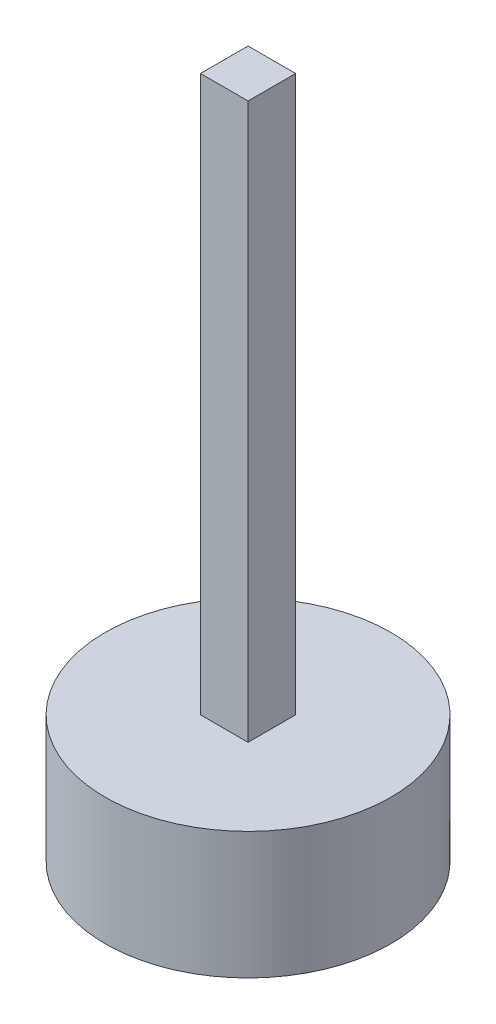
ISO-10303-21;
HEADER;
FILE_DESCRIPTION(('STEP AP214'),'2;1');
FILE_NAME('part.step','',(''),(''),'','','');
FILE_SCHEMA(('AUTOMOTIVE_DESIGN { 1 0 10303 214 1 1 1 1 }'));
ENDSEC;
DATA;
#1=APPLICATION_CONTEXT('core data for automotive mechanical design processes');
#2=APPLICATION_PROTOCOL_DEFINITION('international standard','automotive_design',2000,#1);
#3=PRODUCT_CONTEXT('',#1,'mechanical');
#4=PRODUCT('Part','Part','',(#3));
#5=PRODUCT_RELATED_PRODUCT_CATEGORY('part','',(#4));
#6=PRODUCT_DEFINITION_FORMATION('','',#4);
#7=PRODUCT_DEFINITION_CONTEXT('part definition',#1,'design');
#8=PRODUCT_DEFINITION('design','',#6,#7);
#9=PRODUCT_DEFINITION_SHAPE('','',#8);
#10=(LENGTH_UNIT() NAMED_UNIT(*) SI_UNIT(.MILLI.,.METRE.));
#11=(NAMED_UNIT(*) PLANE_ANGLE_UNIT() SI_UNIT($,.RADIAN.));
#12=(NAMED_UNIT(*) SI_UNIT($,.STERADIAN.) SOLID_ANGLE_UNIT());
#13=UNCERTAINTY_MEASURE_WITH_UNIT(LENGTH_MEASURE(1.E-05),#10,'distance_accuracy_value','');
#14=(GEOMETRIC_REPRESENTATION_CONTEXT(3) GLOBAL_UNCERTAINTY_ASSIGNED_CONTEXT((#13)) GLOBAL_UNIT_ASSIGNED_CONTEXT((#10,
#11,#12)) REPRESENTATION_CONTEXT('',''));
#15=CARTESIAN_POINT('',(0.,0.,0.));
#16=DIRECTION('',(0.,0.,1.));
#17=DIRECTION('',(1.,0.,0.));
#18=AXIS2_PLACEMENT_3D('',#15,#16,#17);
#19=CARTESIAN_POINT('',(15.,-350.,0.));
#20=DIRECTION('',(1.,0.,0.));
#21=DIRECTION('',(0.,0.,-1.));
#22=AXIS2_PLACEMENT_3D('',#19,#20,#21);
#23=PLANE('',#22);
#24=DIRECTION('',(0.,0.,-1.));
#25=VECTOR('',#24,1.);
#26=CARTESIAN_POINT('',(15.,0.,0.));
#27=LINE('',#26,#25);
#28=CARTESIAN_POINT('',(15.,0.,0.));
#29=VERTEX_POINT('',#28);
#30=CARTESIAN_POINT('',(15.,0.,-30.));
#31=VERTEX_POINT('',#30);
#32=EDGE_CURVE('E104',#29,#31,#27,.T.);
#33=ORIENTED_EDGE('',*,*,#32,.F.);
#34=DIRECTION('',(0.,1.,0.));
#35=VECTOR('',#34,1.);
#36=CARTESIAN_POINT('',(15.,-350.,0.));
#37=LINE('',#36,#35);
#38=CARTESIAN_POINT('',(15.,-350.,0.));
#39=VERTEX_POINT('',#38);
#40=EDGE_CURVE('E11',#39,#29,#37,.T.);
#41=ORIENTED_EDGE('',*,*,#40,.F.);
#42=DIRECTION('',(0.,0.,-1.));
#43=VECTOR('',#42,1.);
#44=CARTESIAN_POINT('',(15.,-350.,0.));
#45=LINE('',#44,#43);
#46=CARTESIAN_POINT('',(15.,-350.,-30.));
#47=VERTEX_POINT('',#46);
#48=EDGE_CURVE('E89',#39,#47,#45,.T.);
#49=ORIENTED_EDGE('',*,*,#48,.T.);
#50=DIRECTION('',(0.,1.,0.));
#51=VECTOR('',#50,1.);
#52=CARTESIAN_POINT('',(15.,-350.,-30.));
#53=LINE('',#52,#51);
#54=EDGE_CURVE('E38',#47,#31,#53,.T.);
#55=ORIENTED_EDGE('',*,*,#54,.T.);
#56=EDGE_LOOP('',(#33,#41,#49,#55));
#57=FACE_BOUND('',#56,.T.);
#58=ADVANCED_FACE('F35',(#57),#23,.T.);
#59=CARTESIAN_POINT('',(15.,-350.,0.));
#60=DIRECTION('',(0.,0.,1.));
#61=DIRECTION('',(1.,0.,0.));
#62=AXIS2_PLACEMENT_3D('',#59,#60,#61);
#63=PLANE('',#62);
#64=DIRECTION('',(1.,0.,0.));
#65=VECTOR('',#64,1.);
#66=CARTESIAN_POINT('',(15.,0.,0.));
#67=LINE('',#66,#65);
#68=CARTESIAN_POINT('',(-15.,0.,0.));
#69=VERTEX_POINT('',#68);
#70=EDGE_CURVE('E82',#69,#29,#67,.T.);
#71=ORIENTED_EDGE('',*,*,#70,.F.);
#72=DIRECTION('',(0.,1.,0.));
#73=VECTOR('',#72,1.);
#74=CARTESIAN_POINT('',(-15.,-350.,0.));
#75=LINE('',#74,#73);
#76=CARTESIAN_POINT('',(-15.,-350.,0.));
#77=VERTEX_POINT('',#76);
#78=EDGE_CURVE('E44',#77,#69,#75,.T.);
#79=ORIENTED_EDGE('',*,*,#78,.F.);
#80=DIRECTION('',(1.,0.,0.));
#81=VECTOR('',#80,1.);
#82=CARTESIAN_POINT('',(15.,-350.,0.));
#83=LINE('',#82,#81);
#84=EDGE_CURVE('E97',#77,#39,#83,.T.);
#85=ORIENTED_EDGE('',*,*,#84,.T.);
#86=ORIENTED_EDGE('',*,*,#40,.T.);
#87=EDGE_LOOP('',(#71,#79,#85,#86));
#88=FACE_BOUND('',#87,.T.);
#89=ADVANCED_FACE('F86',(#88),#63,.T.);
#90=CARTESIAN_POINT('',(-15.,-350.,0.));
#91=DIRECTION('',(-1.,0.,0.));
#92=DIRECTION('',(0.,0.,1.));
#93=AXIS2_PLACEMENT_3D('',#90,#91,#92);
#94=PLANE('',#93);
#95=DIRECTION('',(0.,0.,1.));
#96=VECTOR('',#95,1.);
#97=CARTESIAN_POINT('',(-15.,0.,0.));
#98=LINE('',#97,#96);
#99=CARTESIAN_POINT('',(-15.,0.,-30.));
#100=VERTEX_POINT('',#99);
#101=EDGE_CURVE('E70',#100,#69,#98,.T.);
#102=ORIENTED_EDGE('',*,*,#101,.F.);
#103=DIRECTION('',(0.,1.,0.));
#104=VECTOR('',#103,1.);
#105=CARTESIAN_POINT('',(-15.,-350.,-30.));
#106=LINE('',#105,#104);
#107=CARTESIAN_POINT('',(-15.,-350.,-30.));
#108=VERTEX_POINT('',#107);
#109=EDGE_CURVE('E76',#108,#100,#106,.T.);
#110=ORIENTED_EDGE('',*,*,#109,.F.);
#111=DIRECTION('',(0.,0.,1.));
#112=VECTOR('',#111,1.);
#113=CARTESIAN_POINT('',(-15.,-350.,0.));
#114=LINE('',#113,#112);
#115=EDGE_CURVE('E52',#108,#77,#114,.T.);
#116=ORIENTED_EDGE('',*,*,#115,.T.);
#117=ORIENTED_EDGE('',*,*,#78,.T.);
#118=EDGE_LOOP('',(#102,#110,#116,#117));
#119=FACE_BOUND('',#118,.T.);
#120=ADVANCED_FACE('F69',(#119),#94,.T.);
#121=CARTESIAN_POINT('',(15.,-350.,-30.));
#122=DIRECTION('',(0.,0.,-1.));
#123=DIRECTION('',(-1.,0.,0.));
#124=AXIS2_PLACEMENT_3D('',#121,#122,#123);
#125=PLANE('',#124);
#126=DIRECTION('',(-1.,0.,0.));
#127=VECTOR('',#126,1.);
#128=CARTESIAN_POINT('',(15.,0.,-30.));
#129=LINE('',#128,#127);
#130=EDGE_CURVE('E84',#31,#100,#129,.T.);
#131=ORIENTED_EDGE('',*,*,#130,.F.);
#132=ORIENTED_EDGE('',*,*,#54,.F.);
#133=DIRECTION('',(-1.,0.,0.));
#134=VECTOR('',#133,1.);
#135=CARTESIAN_POINT('',(15.,-350.,-30.));
#136=LINE('',#135,#134);
#137=EDGE_CURVE('E92',#47,#108,#136,.T.);
#138=ORIENTED_EDGE('',*,*,#137,.T.);
#139=ORIENTED_EDGE('',*,*,#109,.T.);
#140=EDGE_LOOP('',(#131,#132,#138,#139));
#141=FACE_BOUND('',#140,.T.);
#142=ADVANCED_FACE('F113',(#141),#125,.T.);
#143=CARTESIAN_POINT('',(0.,0.,0.));
#144=DIRECTION('',(0.,1.,0.));
#145=DIRECTION('',(0.,0.,1.));
#146=AXIS2_PLACEMENT_3D('',#143,#144,#145);
#147=PLANE('',#146);
#148=ORIENTED_EDGE('',*,*,#32,.T.);
#149=ORIENTED_EDGE('',*,*,#130,.T.);
#150=ORIENTED_EDGE('',*,*,#101,.T.);
#151=ORIENTED_EDGE('',*,*,#70,.T.);
#152=EDGE_LOOP('',(#148,#149,#150,#151));
#153=FACE_BOUND('',#152,.T.);
#154=ADVANCED_FACE('F81',(#153),#147,.T.);
#155=CARTESIAN_POINT('',(0.,-430.,-15.));
#156=DIRECTION('',(0.,1.,0.));
#157=DIRECTION('',(0.,0.,1.));
#158=AXIS2_PLACEMENT_3D('',#155,#156,#157);
#159=CYLINDRICAL_SURFACE('',#158,90.);
#160=CARTESIAN_POINT('',(0.,-430.,-15.));
#161=DIRECTION('',(0.,-1.,0.));
#162=DIRECTION('',(0.,0.,-1.));
#163=AXIS2_PLACEMENT_3D('',#160,#161,#162);
#164=CIRCLE('',#163,90.);
#165=CARTESIAN_POINT('',(0.,-430.,-105.));
#166=VERTEX_POINT('',#165);
#167=EDGE_CURVE('E105',#166,#166,#164,.T.);
#168=ORIENTED_EDGE('',*,*,#167,.F.);
#169=EDGE_LOOP('',(#168));
#170=FACE_BOUND('',#169,.T.);
#171=CARTESIAN_POINT('',(0.,-350.,-15.));
#172=DIRECTION('',(0.,-1.,0.));
#173=DIRECTION('',(0.,0.,-1.));
#174=AXIS2_PLACEMENT_3D('',#171,#172,#173);
#175=CIRCLE('',#174,90.);
#176=CARTESIAN_POINT('',(0.,-350.,-105.));
#177=VERTEX_POINT('',#176);
#178=EDGE_CURVE('E107',#177,#177,#175,.T.);
#179=ORIENTED_EDGE('',*,*,#178,.T.);
#180=EDGE_LOOP('',(#179));
#181=FACE_BOUND('',#180,.T.);
#182=ADVANCED_FACE('F134',(#170,#181),#159,.T.);
#183=CARTESIAN_POINT('',(0.,-430.,-15.));
#184=DIRECTION('',(0.,-1.,0.));
#185=DIRECTION('',(0.,0.,-1.));
#186=AXIS2_PLACEMENT_3D('',#183,#184,#185);
#187=PLANE('',#186);
#188=ORIENTED_EDGE('',*,*,#167,.T.);
#189=EDGE_LOOP('',(#188));
#190=FACE_BOUND('',#189,.T.);
#191=ADVANCED_FACE('F138',(#190),#187,.T.);
#192=CARTESIAN_POINT('',(0.,-350.,-15.));
#193=DIRECTION('',(0.,-1.,0.));
#194=DIRECTION('',(0.,0.,-1.));
#195=AXIS2_PLACEMENT_3D('',#192,#193,#194);
#196=PLANE('',#195);
#197=ORIENTED_EDGE('',*,*,#48,.F.);
#198=ORIENTED_EDGE('',*,*,#84,.F.);
#199=ORIENTED_EDGE('',*,*,#115,.F.);
#200=ORIENTED_EDGE('',*,*,#137,.F.);
#201=EDGE_LOOP('',(#197,#198,#199,#200));
#202=FACE_BOUND('',#201,.T.);
#203=ORIENTED_EDGE('',*,*,#178,.F.);
#204=EDGE_LOOP('',(#203));
#205=FACE_BOUND('',#204,.T.);
#206=ADVANCED_FACE('F116',(#202,#205),#196,.F.);
#207=CLOSED_SHELL('',(#58,#89,#120,#142,#154,#182,#191,#206));
#208=MANIFOLD_SOLID_BREP('B2',#207);
#209=ADVANCED_BREP_SHAPE_REPRESENTATION('',(#18,#208),#14);
#210=SHAPE_DEFINITION_REPRESENTATION(#9,#209);
ENDSEC;
END-ISO-10303-21;
